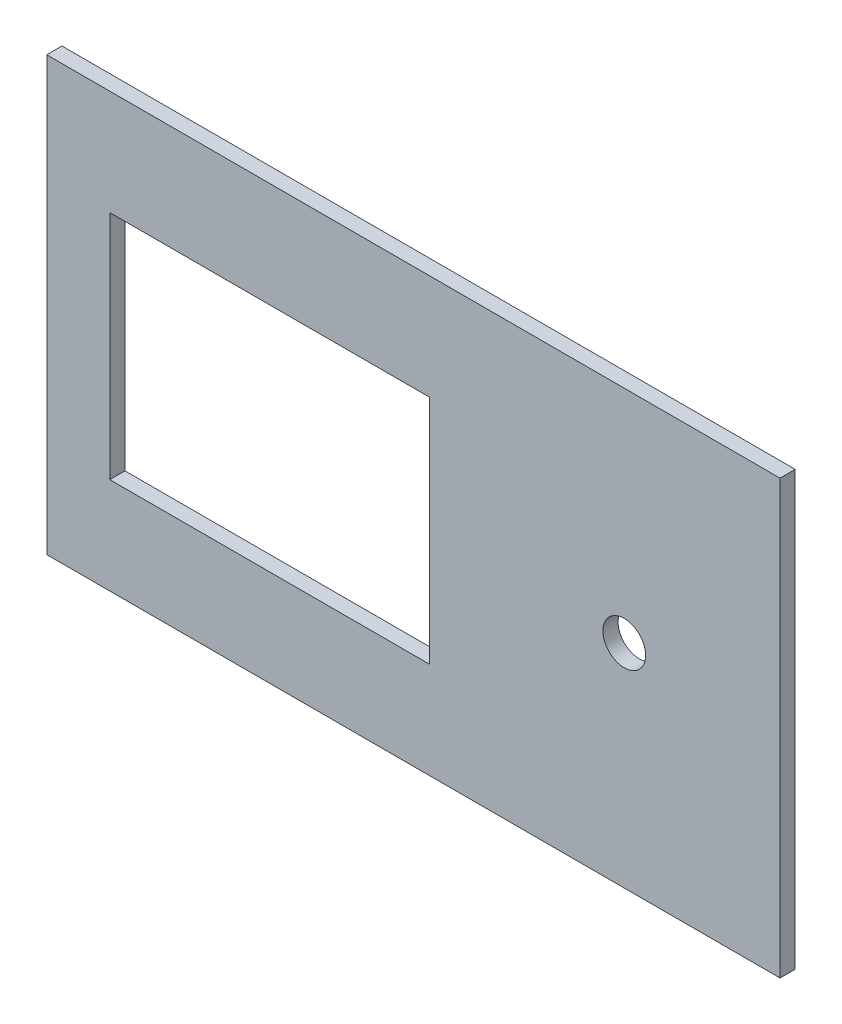
ISO-10303-21;
HEADER;
FILE_DESCRIPTION(('STEP AP214'),'2;1');
FILE_NAME('part.step','',(''),(''),'','','');
FILE_SCHEMA(('AUTOMOTIVE_DESIGN { 1 0 10303 214 1 1 1 1 }'));
ENDSEC;
DATA;
#1=APPLICATION_CONTEXT('core data for automotive mechanical design processes');
#2=APPLICATION_PROTOCOL_DEFINITION('international standard','automotive_design',2000,#1);
#3=PRODUCT_CONTEXT('',#1,'mechanical');
#4=PRODUCT('Part','Part','',(#3));
#5=PRODUCT_RELATED_PRODUCT_CATEGORY('part','',(#4));
#6=PRODUCT_DEFINITION_FORMATION('','',#4);
#7=PRODUCT_DEFINITION_CONTEXT('part definition',#1,'design');
#8=PRODUCT_DEFINITION('design','',#6,#7);
#9=PRODUCT_DEFINITION_SHAPE('','',#8);
#10=(LENGTH_UNIT() NAMED_UNIT(*) SI_UNIT(.MILLI.,.METRE.));
#11=(NAMED_UNIT(*) PLANE_ANGLE_UNIT() SI_UNIT($,.RADIAN.));
#12=(NAMED_UNIT(*) SI_UNIT($,.STERADIAN.) SOLID_ANGLE_UNIT());
#13=UNCERTAINTY_MEASURE_WITH_UNIT(LENGTH_MEASURE(1.E-05),#10,'distance_accuracy_value','');
#14=(GEOMETRIC_REPRESENTATION_CONTEXT(3) GLOBAL_UNCERTAINTY_ASSIGNED_CONTEXT((#13)) GLOBAL_UNIT_ASSIGNED_CONTEXT((#10,
#11,#12)) REPRESENTATION_CONTEXT('',''));
#15=CARTESIAN_POINT('',(0.,0.,0.));
#16=DIRECTION('',(0.,0.,1.));
#17=DIRECTION('',(1.,0.,0.));
#18=AXIS2_PLACEMENT_3D('',#15,#16,#17);
#19=CARTESIAN_POINT('',(0.,0.,3.));
#20=DIRECTION('',(0.,0.,1.));
#21=DIRECTION('',(1.,0.,0.));
#22=AXIS2_PLACEMENT_3D('',#19,#20,#21);
#23=PLANE('',#22);
#24=DIRECTION('',(1.,0.,0.));
#25=VECTOR('',#24,1.);
#26=CARTESIAN_POINT('',(94.481847,-125.249899,3.));
#27=LINE('',#26,#25);
#28=CARTESIAN_POINT('',(94.481847,-125.249899,3.));
#29=VERTEX_POINT('',#28);
#30=CARTESIAN_POINT('',(157.601847,-125.249899,3.));
#31=VERTEX_POINT('',#30);
#32=EDGE_CURVE('E105',#29,#31,#27,.T.);
#33=ORIENTED_EDGE('',*,*,#32,.F.);
#34=DIRECTION('',(0.,-1.,0.));
#35=VECTOR('',#34,1.);
#36=CARTESIAN_POINT('',(94.481847,-79.571899,3.));
#37=LINE('',#36,#35);
#38=CARTESIAN_POINT('',(94.481847,-79.571899,3.));
#39=VERTEX_POINT('',#38);
#40=EDGE_CURVE('E97',#39,#29,#37,.T.);
#41=ORIENTED_EDGE('',*,*,#40,.F.);
#42=DIRECTION('',(-1.,0.,0.));
#43=VECTOR('',#42,1.);
#44=CARTESIAN_POINT('',(94.481847,-79.571899,3.));
#45=LINE('',#44,#43);
#46=CARTESIAN_POINT('',(157.601847,-79.571899,3.));
#47=VERTEX_POINT('',#46);
#48=EDGE_CURVE('E120',#47,#39,#45,.T.);
#49=ORIENTED_EDGE('',*,*,#48,.F.);
#50=DIRECTION('',(0.,1.,0.));
#51=VECTOR('',#50,1.);
#52=CARTESIAN_POINT('',(157.601847,-79.571899,3.));
#53=LINE('',#52,#51);
#54=EDGE_CURVE('E118',#31,#47,#53,.T.);
#55=ORIENTED_EDGE('',*,*,#54,.F.);
#56=EDGE_LOOP('',(#33,#41,#49,#55));
#57=FACE_BOUND('',#56,.T.);
#58=DIRECTION('',(0.,-1.,0.));
#59=VECTOR('',#58,1.);
#60=CARTESIAN_POINT('',(82.0372866060114,-58.7999400781502,3.));
#61=LINE('',#60,#59);
#62=CARTESIAN_POINT('',(82.0372866060114,-58.7999400781502,3.));
#63=VERTEX_POINT('',#62);
#64=CARTESIAN_POINT('',(82.0372866060114,-144.304008749595,3.));
#65=VERTEX_POINT('',#64);
#66=EDGE_CURVE('E136',#63,#65,#61,.T.);
#67=ORIENTED_EDGE('',*,*,#66,.T.);
#68=DIRECTION('',(1.,0.,0.));
#69=VECTOR('',#68,1.);
#70=CARTESIAN_POINT('',(82.0372866060114,-144.304008749595,3.));
#71=LINE('',#70,#69);
#72=CARTESIAN_POINT('',(226.87070904948,-144.304008749595,3.));
#73=VERTEX_POINT('',#72);
#74=EDGE_CURVE('E139',#65,#73,#71,.T.);
#75=ORIENTED_EDGE('',*,*,#74,.T.);
#76=DIRECTION('',(0.,1.,0.));
#77=VECTOR('',#76,1.);
#78=CARTESIAN_POINT('',(226.87070904948,-58.7999400781502,3.));
#79=LINE('',#78,#77);
#80=CARTESIAN_POINT('',(226.87070904948,-58.7999400781502,3.));
#81=VERTEX_POINT('',#80);
#82=EDGE_CURVE('E142',#73,#81,#79,.T.);
#83=ORIENTED_EDGE('',*,*,#82,.T.);
#84=DIRECTION('',(-1.,0.,0.));
#85=VECTOR('',#84,1.);
#86=CARTESIAN_POINT('',(82.0372866060114,-58.7999400781502,3.));
#87=LINE('',#86,#85);
#88=EDGE_CURVE('E144',#81,#63,#87,.T.);
#89=ORIENTED_EDGE('',*,*,#88,.T.);
#90=EDGE_LOOP('',(#67,#75,#83,#89));
#91=FACE_BOUND('',#90,.T.);
#92=CARTESIAN_POINT('',(196.099847,-102.399899,3.));
#93=DIRECTION('',(0.,0.,1.));
#94=DIRECTION('',(1.,0.,0.));
#95=AXIS2_PLACEMENT_3D('',#92,#93,#94);
#96=CIRCLE('',#95,4.22083174868336);
#97=CARTESIAN_POINT('',(200.320678748683,-102.399899,3.));
#98=VERTEX_POINT('',#97);
#99=EDGE_CURVE('E126',#98,#98,#96,.T.);
#100=ORIENTED_EDGE('',*,*,#99,.F.);
#101=EDGE_LOOP('',(#100));
#102=FACE_BOUND('',#101,.T.);
#103=ADVANCED_FACE('F32',(#57,#91,#102),#23,.T.);
#104=CARTESIAN_POINT('',(0.,0.,0.));
#105=DIRECTION('',(0.,0.,1.));
#106=DIRECTION('',(1.,0.,0.));
#107=AXIS2_PLACEMENT_3D('',#104,#105,#106);
#108=PLANE('',#107);
#109=DIRECTION('',(0.,-1.,0.));
#110=VECTOR('',#109,1.);
#111=CARTESIAN_POINT('',(82.0372866060114,-58.7999400781502,0.));
#112=LINE('',#111,#110);
#113=CARTESIAN_POINT('',(82.0372866060114,-58.7999400781502,0.));
#114=VERTEX_POINT('',#113);
#115=CARTESIAN_POINT('',(82.0372866060114,-144.304008749595,0.));
#116=VERTEX_POINT('',#115);
#117=EDGE_CURVE('E113',#114,#116,#112,.T.);
#118=ORIENTED_EDGE('',*,*,#117,.F.);
#119=DIRECTION('',(-1.,0.,0.));
#120=VECTOR('',#119,1.);
#121=CARTESIAN_POINT('',(82.0372866060114,-58.7999400781502,0.));
#122=LINE('',#121,#120);
#123=CARTESIAN_POINT('',(226.87070904948,-58.7999400781502,0.));
#124=VERTEX_POINT('',#123);
#125=EDGE_CURVE('E140',#124,#114,#122,.T.);
#126=ORIENTED_EDGE('',*,*,#125,.F.);
#127=DIRECTION('',(0.,1.,0.));
#128=VECTOR('',#127,1.);
#129=CARTESIAN_POINT('',(226.87070904948,-58.7999400781502,0.));
#130=LINE('',#129,#128);
#131=CARTESIAN_POINT('',(226.87070904948,-144.304008749595,0.));
#132=VERTEX_POINT('',#131);
#133=EDGE_CURVE('E151',#132,#124,#130,.T.);
#134=ORIENTED_EDGE('',*,*,#133,.F.);
#135=DIRECTION('',(1.,0.,0.));
#136=VECTOR('',#135,1.);
#137=CARTESIAN_POINT('',(82.0372866060114,-144.304008749595,0.));
#138=LINE('',#137,#136);
#139=EDGE_CURVE('E149',#116,#132,#138,.T.);
#140=ORIENTED_EDGE('',*,*,#139,.F.);
#141=EDGE_LOOP('',(#118,#126,#134,#140));
#142=FACE_BOUND('',#141,.T.);
#143=DIRECTION('',(0.,-1.,0.));
#144=VECTOR('',#143,1.);
#145=CARTESIAN_POINT('',(94.481847,-79.571899,0.));
#146=LINE('',#145,#144);
#147=CARTESIAN_POINT('',(94.481847,-79.571899,0.));
#148=VERTEX_POINT('',#147);
#149=CARTESIAN_POINT('',(94.481847,-125.249899,0.));
#150=VERTEX_POINT('',#149);
#151=EDGE_CURVE('E55',#148,#150,#146,.T.);
#152=ORIENTED_EDGE('',*,*,#151,.T.);
#153=DIRECTION('',(1.,0.,0.));
#154=VECTOR('',#153,1.);
#155=CARTESIAN_POINT('',(94.481847,-125.249899,0.));
#156=LINE('',#155,#154);
#157=CARTESIAN_POINT('',(157.601847,-125.249899,0.));
#158=VERTEX_POINT('',#157);
#159=EDGE_CURVE('E112',#150,#158,#156,.T.);
#160=ORIENTED_EDGE('',*,*,#159,.T.);
#161=DIRECTION('',(0.,1.,0.));
#162=VECTOR('',#161,1.);
#163=CARTESIAN_POINT('',(157.601847,-79.571899,0.));
#164=LINE('',#163,#162);
#165=CARTESIAN_POINT('',(157.601847,-79.571899,0.));
#166=VERTEX_POINT('',#165);
#167=EDGE_CURVE('E128',#158,#166,#164,.T.);
#168=ORIENTED_EDGE('',*,*,#167,.T.);
#169=DIRECTION('',(-1.,0.,0.));
#170=VECTOR('',#169,1.);
#171=CARTESIAN_POINT('',(94.481847,-79.571899,0.));
#172=LINE('',#171,#170);
#173=EDGE_CURVE('E106',#166,#148,#172,.T.);
#174=ORIENTED_EDGE('',*,*,#173,.T.);
#175=EDGE_LOOP('',(#152,#160,#168,#174));
#176=FACE_BOUND('',#175,.T.);
#177=CARTESIAN_POINT('',(196.099847,-102.399899,0.));
#178=DIRECTION('',(0.,0.,1.));
#179=DIRECTION('',(1.,0.,0.));
#180=AXIS2_PLACEMENT_3D('',#177,#178,#179);
#181=CIRCLE('',#180,4.22083174868336);
#182=CARTESIAN_POINT('',(200.320678748683,-102.399899,0.));
#183=VERTEX_POINT('',#182);
#184=EDGE_CURVE('E222',#183,#183,#181,.T.);
#185=ORIENTED_EDGE('',*,*,#184,.T.);
#186=EDGE_LOOP('',(#185));
#187=FACE_BOUND('',#186,.T.);
#188=ADVANCED_FACE('F169',(#142,#176,#187),#108,.F.);
#189=CARTESIAN_POINT('',(82.0372866060114,-58.7999400781502,3.));
#190=DIRECTION('',(1.,0.,0.));
#191=DIRECTION('',(0.,0.,-1.));
#192=AXIS2_PLACEMENT_3D('',#189,#190,#191);
#193=PLANE('',#192);
#194=ORIENTED_EDGE('',*,*,#117,.T.);
#195=DIRECTION('',(0.,0.,-1.));
#196=VECTOR('',#195,1.);
#197=CARTESIAN_POINT('',(82.0372866060114,-144.304008749595,3.));
#198=LINE('',#197,#196);
#199=EDGE_CURVE('E11',#65,#116,#198,.T.);
#200=ORIENTED_EDGE('',*,*,#199,.F.);
#201=ORIENTED_EDGE('',*,*,#66,.F.);
#202=DIRECTION('',(0.,0.,-1.));
#203=VECTOR('',#202,1.);
#204=CARTESIAN_POINT('',(82.0372866060114,-58.7999400781502,3.));
#205=LINE('',#204,#203);
#206=EDGE_CURVE('E146',#63,#114,#205,.T.);
#207=ORIENTED_EDGE('',*,*,#206,.T.);
#208=EDGE_LOOP('',(#194,#200,#201,#207));
#209=FACE_BOUND('',#208,.T.);
#210=ADVANCED_FACE('F34',(#209),#193,.F.);
#211=CARTESIAN_POINT('',(82.0372866060114,-144.304008749595,3.));
#212=DIRECTION('',(0.,1.,0.));
#213=DIRECTION('',(0.,0.,1.));
#214=AXIS2_PLACEMENT_3D('',#211,#212,#213);
#215=PLANE('',#214);
#216=ORIENTED_EDGE('',*,*,#139,.T.);
#217=DIRECTION('',(0.,0.,-1.));
#218=VECTOR('',#217,1.);
#219=CARTESIAN_POINT('',(226.87070904948,-144.304008749595,3.));
#220=LINE('',#219,#218);
#221=EDGE_CURVE('E40',#73,#132,#220,.T.);
#222=ORIENTED_EDGE('',*,*,#221,.F.);
#223=ORIENTED_EDGE('',*,*,#74,.F.);
#224=ORIENTED_EDGE('',*,*,#199,.T.);
#225=EDGE_LOOP('',(#216,#222,#223,#224));
#226=FACE_BOUND('',#225,.T.);
#227=ADVANCED_FACE('F179',(#226),#215,.F.);
#228=CARTESIAN_POINT('',(226.87070904948,-58.7999400781502,3.));
#229=DIRECTION('',(-1.,0.,0.));
#230=DIRECTION('',(0.,0.,1.));
#231=AXIS2_PLACEMENT_3D('',#228,#229,#230);
#232=PLANE('',#231);
#233=ORIENTED_EDGE('',*,*,#133,.T.);
#234=DIRECTION('',(0.,0.,-1.));
#235=VECTOR('',#234,1.);
#236=CARTESIAN_POINT('',(226.87070904948,-58.7999400781502,3.));
#237=LINE('',#236,#235);
#238=EDGE_CURVE('E156',#81,#124,#237,.T.);
#239=ORIENTED_EDGE('',*,*,#238,.F.);
#240=ORIENTED_EDGE('',*,*,#82,.F.);
#241=ORIENTED_EDGE('',*,*,#221,.T.);
#242=EDGE_LOOP('',(#233,#239,#240,#241));
#243=FACE_BOUND('',#242,.T.);
#244=ADVANCED_FACE('F163',(#243),#232,.F.);
#245=CARTESIAN_POINT('',(82.0372866060114,-58.7999400781502,3.));
#246=DIRECTION('',(0.,-1.,0.));
#247=DIRECTION('',(0.,0.,-1.));
#248=AXIS2_PLACEMENT_3D('',#245,#246,#247);
#249=PLANE('',#248);
#250=ORIENTED_EDGE('',*,*,#125,.T.);
#251=ORIENTED_EDGE('',*,*,#206,.F.);
#252=ORIENTED_EDGE('',*,*,#88,.F.);
#253=ORIENTED_EDGE('',*,*,#238,.T.);
#254=EDGE_LOOP('',(#250,#251,#252,#253));
#255=FACE_BOUND('',#254,.T.);
#256=ADVANCED_FACE('F173',(#255),#249,.F.);
#257=CARTESIAN_POINT('',(94.481847,-79.571899,3.));
#258=DIRECTION('',(1.,0.,0.));
#259=DIRECTION('',(0.,0.,-1.));
#260=AXIS2_PLACEMENT_3D('',#257,#258,#259);
#261=PLANE('',#260);
#262=ORIENTED_EDGE('',*,*,#151,.F.);
#263=DIRECTION('',(0.,0.,-1.));
#264=VECTOR('',#263,1.);
#265=CARTESIAN_POINT('',(94.481847,-79.571899,3.));
#266=LINE('',#265,#264);
#267=EDGE_CURVE('E101',#39,#148,#266,.T.);
#268=ORIENTED_EDGE('',*,*,#267,.F.);
#269=ORIENTED_EDGE('',*,*,#40,.T.);
#270=DIRECTION('',(0.,0.,-1.));
#271=VECTOR('',#270,1.);
#272=CARTESIAN_POINT('',(94.481847,-125.249899,3.));
#273=LINE('',#272,#271);
#274=EDGE_CURVE('E100',#29,#150,#273,.T.);
#275=ORIENTED_EDGE('',*,*,#274,.T.);
#276=EDGE_LOOP('',(#262,#268,#269,#275));
#277=FACE_BOUND('',#276,.T.);
#278=ADVANCED_FACE('F99',(#277),#261,.T.);
#279=CARTESIAN_POINT('',(94.481847,-125.249899,3.));
#280=DIRECTION('',(0.,1.,0.));
#281=DIRECTION('',(0.,0.,1.));
#282=AXIS2_PLACEMENT_3D('',#279,#280,#281);
#283=PLANE('',#282);
#284=ORIENTED_EDGE('',*,*,#159,.F.);
#285=ORIENTED_EDGE('',*,*,#274,.F.);
#286=ORIENTED_EDGE('',*,*,#32,.T.);
#287=DIRECTION('',(0.,0.,-1.));
#288=VECTOR('',#287,1.);
#289=CARTESIAN_POINT('',(157.601847,-125.249899,3.));
#290=LINE('',#289,#288);
#291=EDGE_CURVE('E114',#31,#158,#290,.T.);
#292=ORIENTED_EDGE('',*,*,#291,.T.);
#293=EDGE_LOOP('',(#284,#285,#286,#292));
#294=FACE_BOUND('',#293,.T.);
#295=ADVANCED_FACE('F109',(#294),#283,.T.);
#296=CARTESIAN_POINT('',(157.601847,-79.571899,3.));
#297=DIRECTION('',(-1.,0.,0.));
#298=DIRECTION('',(0.,0.,1.));
#299=AXIS2_PLACEMENT_3D('',#296,#297,#298);
#300=PLANE('',#299);
#301=ORIENTED_EDGE('',*,*,#167,.F.);
#302=ORIENTED_EDGE('',*,*,#291,.F.);
#303=ORIENTED_EDGE('',*,*,#54,.T.);
#304=DIRECTION('',(0.,0.,-1.));
#305=VECTOR('',#304,1.);
#306=CARTESIAN_POINT('',(157.601847,-79.571899,3.));
#307=LINE('',#306,#305);
#308=EDGE_CURVE('E47',#47,#166,#307,.T.);
#309=ORIENTED_EDGE('',*,*,#308,.T.);
#310=EDGE_LOOP('',(#301,#302,#303,#309));
#311=FACE_BOUND('',#310,.T.);
#312=ADVANCED_FACE('F202',(#311),#300,.T.);
#313=CARTESIAN_POINT('',(94.481847,-79.571899,3.));
#314=DIRECTION('',(0.,-1.,0.));
#315=DIRECTION('',(0.,0.,-1.));
#316=AXIS2_PLACEMENT_3D('',#313,#314,#315);
#317=PLANE('',#316);
#318=ORIENTED_EDGE('',*,*,#173,.F.);
#319=ORIENTED_EDGE('',*,*,#308,.F.);
#320=ORIENTED_EDGE('',*,*,#48,.T.);
#321=ORIENTED_EDGE('',*,*,#267,.T.);
#322=EDGE_LOOP('',(#318,#319,#320,#321));
#323=FACE_BOUND('',#322,.T.);
#324=ADVANCED_FACE('F206',(#323),#317,.T.);
#325=CARTESIAN_POINT('',(196.099847,-102.399899,3.));
#326=DIRECTION('',(0.,0.,-1.));
#327=DIRECTION('',(-1.,0.,0.));
#328=AXIS2_PLACEMENT_3D('',#325,#326,#327);
#329=CYLINDRICAL_SURFACE('',#328,4.22083174868336);
#330=ORIENTED_EDGE('',*,*,#99,.T.);
#331=EDGE_LOOP('',(#330));
#332=FACE_BOUND('',#331,.T.);
#333=ORIENTED_EDGE('',*,*,#184,.F.);
#334=EDGE_LOOP('',(#333));
#335=FACE_BOUND('',#334,.T.);
#336=ADVANCED_FACE('F212',(#332,#335),#329,.F.);
#337=CLOSED_SHELL('',(#103,#188,#210,#227,#244,#256,#278,#295,#312,#324,#336));
#338=MANIFOLD_SOLID_BREP('B2',#337);
#339=ADVANCED_BREP_SHAPE_REPRESENTATION('',(#18,#338),#14);
#340=SHAPE_DEFINITION_REPRESENTATION(#9,#339);
ENDSEC;
END-ISO-10303-21;
